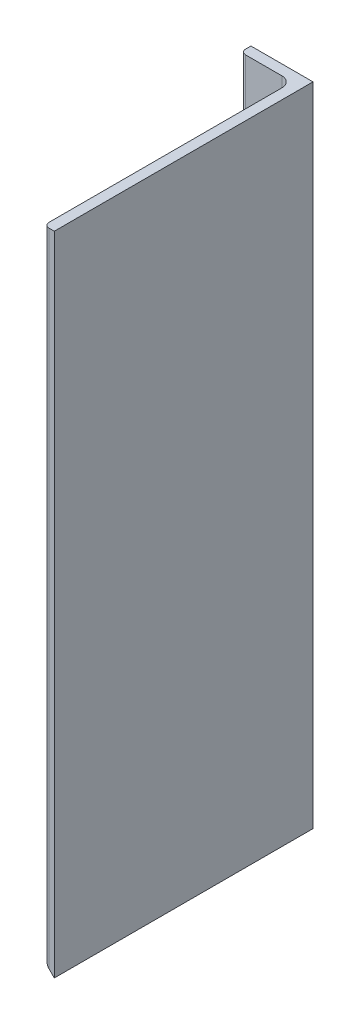
ISO-10303-21;
HEADER;
FILE_DESCRIPTION(('STEP AP214'),'2;1');
FILE_NAME('part.step','',(''),(''),'','','');
FILE_SCHEMA(('AUTOMOTIVE_DESIGN { 1 0 10303 214 1 1 1 1 }'));
ENDSEC;
DATA;
#1=APPLICATION_CONTEXT('core data for automotive mechanical design processes');
#2=APPLICATION_PROTOCOL_DEFINITION('international standard','automotive_design',2000,#1);
#3=PRODUCT_CONTEXT('',#1,'mechanical');
#4=PRODUCT('Part','Part','',(#3));
#5=PRODUCT_RELATED_PRODUCT_CATEGORY('part','',(#4));
#6=PRODUCT_DEFINITION_FORMATION('','',#4);
#7=PRODUCT_DEFINITION_CONTEXT('part definition',#1,'design');
#8=PRODUCT_DEFINITION('design','',#6,#7);
#9=PRODUCT_DEFINITION_SHAPE('','',#8);
#10=(LENGTH_UNIT() NAMED_UNIT(*) SI_UNIT(.MILLI.,.METRE.));
#11=(NAMED_UNIT(*) PLANE_ANGLE_UNIT() SI_UNIT($,.RADIAN.));
#12=(NAMED_UNIT(*) SI_UNIT($,.STERADIAN.) SOLID_ANGLE_UNIT());
#13=UNCERTAINTY_MEASURE_WITH_UNIT(LENGTH_MEASURE(1.E-05),#10,'distance_accuracy_value','');
#14=(GEOMETRIC_REPRESENTATION_CONTEXT(3) GLOBAL_UNCERTAINTY_ASSIGNED_CONTEXT((#13)) GLOBAL_UNIT_ASSIGNED_CONTEXT((#10,
#11,#12)) REPRESENTATION_CONTEXT('',''));
#15=CARTESIAN_POINT('',(0.,0.,0.));
#16=DIRECTION('',(0.,0.,1.));
#17=DIRECTION('',(1.,0.,0.));
#18=AXIS2_PLACEMENT_3D('',#15,#16,#17);
#19=CARTESIAN_POINT('',(172.628739257162,125.,52.4983163281009));
#20=DIRECTION('',(0.,0.,-1.));
#21=DIRECTION('',(-1.,0.,0.));
#22=AXIS2_PLACEMENT_3D('',#19,#20,#21);
#23=PLANE('',#22);
#24=DIRECTION('',(0.,-1.,0.));
#25=VECTOR('',#24,1.);
#26=CARTESIAN_POINT('',(173.628739257162,125.,52.4983163281009));
#27=LINE('',#26,#25);
#28=CARTESIAN_POINT('',(173.628739257162,125.,52.4983163281009));
#29=VERTEX_POINT('',#28);
#30=CARTESIAN_POINT('',(173.628739257162,1.,52.4983163281009));
#31=VERTEX_POINT('',#30);
#32=EDGE_CURVE('E123',#29,#31,#27,.T.);
#33=ORIENTED_EDGE('',*,*,#32,.T.);
#34=DIRECTION('',(-0.707106781186551,0.707106781186544,0.));
#35=VECTOR('',#34,1.);
#36=CARTESIAN_POINT('',(174.628739257162,0.,52.4983163281009));
#37=LINE('',#36,#35);
#38=CARTESIAN_POINT('',(174.628739257162,0.,52.4983163281009));
#39=VERTEX_POINT('',#38);
#40=EDGE_CURVE('E106',#39,#31,#37,.T.);
#41=ORIENTED_EDGE('',*,*,#40,.F.);
#42=DIRECTION('',(0.,-1.,0.));
#43=VECTOR('',#42,1.);
#44=CARTESIAN_POINT('',(174.628739257162,125.,52.4983163281009));
#45=LINE('',#44,#43);
#46=CARTESIAN_POINT('',(174.628739257162,125.,52.4983163281009));
#47=VERTEX_POINT('',#46);
#48=EDGE_CURVE('E121',#47,#39,#45,.T.);
#49=ORIENTED_EDGE('',*,*,#48,.F.);
#50=DIRECTION('',(1.,0.,0.));
#51=VECTOR('',#50,1.);
#52=CARTESIAN_POINT('',(172.628739257162,125.,52.4983163281009));
#53=LINE('',#52,#51);
#54=EDGE_CURVE('E114',#29,#47,#53,.T.);
#55=ORIENTED_EDGE('',*,*,#54,.F.);
#56=EDGE_LOOP('',(#33,#41,#49,#55));
#57=FACE_BOUND('',#56,.T.);
#58=ADVANCED_FACE('F33',(#57),#23,.F.);
#59=CARTESIAN_POINT('',(174.628739257162,125.,52.4983163281009));
#60=DIRECTION('',(-1.,0.,0.));
#61=DIRECTION('',(0.,0.,1.));
#62=AXIS2_PLACEMENT_3D('',#59,#60,#61);
#63=PLANE('',#62);
#64=DIRECTION('',(0.,0.,-1.));
#65=VECTOR('',#64,1.);
#66=CARTESIAN_POINT('',(174.628739257162,0.,52.4983163281009));
#67=LINE('',#66,#65);
#68=CARTESIAN_POINT('',(174.628739257162,0.,2.49831632810092));
#69=VERTEX_POINT('',#68);
#70=EDGE_CURVE('E103',#39,#69,#67,.T.);
#71=ORIENTED_EDGE('',*,*,#70,.T.);
#72=DIRECTION('',(0.,-1.,0.));
#73=VECTOR('',#72,1.);
#74=CARTESIAN_POINT('',(174.628739257162,125.,2.49831632810092));
#75=LINE('',#74,#73);
#76=CARTESIAN_POINT('',(174.628739257162,125.,2.49831632810092));
#77=VERTEX_POINT('',#76);
#78=EDGE_CURVE('E129',#77,#69,#75,.T.);
#79=ORIENTED_EDGE('',*,*,#78,.F.);
#80=DIRECTION('',(0.,0.,-1.));
#81=VECTOR('',#80,1.);
#82=CARTESIAN_POINT('',(174.628739257162,125.,52.4983163281009));
#83=LINE('',#82,#81);
#84=EDGE_CURVE('E127',#47,#77,#83,.T.);
#85=ORIENTED_EDGE('',*,*,#84,.F.);
#86=ORIENTED_EDGE('',*,*,#48,.T.);
#87=EDGE_LOOP('',(#71,#79,#85,#86));
#88=FACE_BOUND('',#87,.T.);
#89=ADVANCED_FACE('F126',(#88),#63,.F.);
#90=CARTESIAN_POINT('',(174.628739257162,125.,2.49831632810092));
#91=DIRECTION('',(0.,0.,1.));
#92=DIRECTION('',(1.,0.,0.));
#93=AXIS2_PLACEMENT_3D('',#90,#91,#92);
#94=PLANE('',#93);
#95=CARTESIAN_POINT('',(167.128739257162,20.,2.49831632810092));
#96=DIRECTION('',(0.,0.,1.));
#97=DIRECTION('',(1.,0.,0.));
#98=AXIS2_PLACEMENT_3D('',#95,#96,#97);
#99=CIRCLE('',#98,1.59999999999999);
#100=CARTESIAN_POINT('',(168.728739257162,20.,2.49831632810092));
#101=VERTEX_POINT('',#100);
#102=EDGE_CURVE('E115',#101,#101,#99,.T.);
#103=ORIENTED_EDGE('',*,*,#102,.T.);
#104=EDGE_LOOP('',(#103));
#105=FACE_BOUND('',#104,.T.);
#106=CARTESIAN_POINT('',(167.128739257162,105.,2.49831632810092));
#107=DIRECTION('',(0.,0.,1.));
#108=DIRECTION('',(1.,0.,0.));
#109=AXIS2_PLACEMENT_3D('',#106,#107,#108);
#110=CIRCLE('',#109,1.59999999999999);
#111=CARTESIAN_POINT('',(168.728739257162,105.,2.49831632810092));
#112=VERTEX_POINT('',#111);
#113=EDGE_CURVE('E183',#112,#112,#110,.T.);
#114=ORIENTED_EDGE('',*,*,#113,.T.);
#115=EDGE_LOOP('',(#114));
#116=FACE_BOUND('',#115,.T.);
#117=ORIENTED_EDGE('',*,*,#78,.T.);
#118=DIRECTION('',(-0.707106781186551,0.707106781186544,0.));
#119=VECTOR('',#118,1.);
#120=CARTESIAN_POINT('',(174.628739257162,0.,2.49831632810092));
#121=LINE('',#120,#119);
#122=CARTESIAN_POINT('',(162.628739257162,11.9999999999999,2.49831632810092));
#123=VERTEX_POINT('',#122);
#124=EDGE_CURVE('E109',#69,#123,#121,.T.);
#125=ORIENTED_EDGE('',*,*,#124,.T.);
#126=DIRECTION('',(0.,-1.,0.));
#127=VECTOR('',#126,1.);
#128=CARTESIAN_POINT('',(162.628739257162,125.,2.49831632810092));
#129=LINE('',#128,#127);
#130=CARTESIAN_POINT('',(162.628739257162,125.,2.49831632810092));
#131=VERTEX_POINT('',#130);
#132=EDGE_CURVE('E134',#131,#123,#129,.T.);
#133=ORIENTED_EDGE('',*,*,#132,.F.);
#134=DIRECTION('',(-1.,0.,0.));
#135=VECTOR('',#134,1.);
#136=CARTESIAN_POINT('',(174.628739257162,125.,2.49831632810092));
#137=LINE('',#136,#135);
#138=EDGE_CURVE('E190',#77,#131,#137,.T.);
#139=ORIENTED_EDGE('',*,*,#138,.F.);
#140=EDGE_LOOP('',(#117,#125,#133,#139));
#141=FACE_BOUND('',#140,.T.);
#142=ADVANCED_FACE('F203',(#105,#116,#141),#94,.F.);
#143=CARTESIAN_POINT('',(162.628739257162,125.,2.49831632810092));
#144=DIRECTION('',(1.,0.,0.));
#145=DIRECTION('',(0.,0.,-1.));
#146=AXIS2_PLACEMENT_3D('',#143,#144,#145);
#147=PLANE('',#146);
#148=ORIENTED_EDGE('',*,*,#132,.T.);
#149=DIRECTION('',(0.,0.,1.));
#150=VECTOR('',#149,1.);
#151=CARTESIAN_POINT('',(162.628739257162,11.9999999999999,2.49831632810092));
#152=LINE('',#151,#150);
#153=CARTESIAN_POINT('',(162.628739257162,11.9999999999999,3.49831632810092));
#154=VERTEX_POINT('',#153);
#155=EDGE_CURVE('E172',#123,#154,#152,.T.);
#156=ORIENTED_EDGE('',*,*,#155,.T.);
#157=DIRECTION('',(0.,-1.,0.));
#158=VECTOR('',#157,1.);
#159=CARTESIAN_POINT('',(162.628739257162,125.,3.49831632810092));
#160=LINE('',#159,#158);
#161=CARTESIAN_POINT('',(162.628739257162,125.,3.49831632810092));
#162=VERTEX_POINT('',#161);
#163=EDGE_CURVE('E132',#154,#162,#160,.F.);
#164=ORIENTED_EDGE('',*,*,#163,.T.);
#165=DIRECTION('',(0.,0.,1.));
#166=VECTOR('',#165,1.);
#167=CARTESIAN_POINT('',(162.628739257162,125.,2.49831632810092));
#168=LINE('',#167,#166);
#169=EDGE_CURVE('E192',#131,#162,#168,.T.);
#170=ORIENTED_EDGE('',*,*,#169,.F.);
#171=EDGE_LOOP('',(#148,#156,#164,#170));
#172=FACE_BOUND('',#171,.T.);
#173=ADVANCED_FACE('F199',(#172),#147,.F.);
#174=CARTESIAN_POINT('',(162.628739257162,125.,4.49831632810092));
#175=DIRECTION('',(0.,0.,-1.));
#176=DIRECTION('',(-1.,0.,0.));
#177=AXIS2_PLACEMENT_3D('',#174,#175,#176);
#178=PLANE('',#177);
#179=CARTESIAN_POINT('',(167.128739257162,20.,4.49831632810092));
#180=DIRECTION('',(0.,0.,1.));
#181=DIRECTION('',(1.,0.,0.));
#182=AXIS2_PLACEMENT_3D('',#179,#180,#181);
#183=CIRCLE('',#182,1.59999999999999);
#184=CARTESIAN_POINT('',(168.728739257162,20.,4.49831632810092));
#185=VERTEX_POINT('',#184);
#186=EDGE_CURVE('E180',#185,#185,#183,.T.);
#187=ORIENTED_EDGE('',*,*,#186,.F.);
#188=EDGE_LOOP('',(#187));
#189=FACE_BOUND('',#188,.T.);
#190=CARTESIAN_POINT('',(167.128739257162,105.,4.49831632810092));
#191=DIRECTION('',(0.,0.,1.));
#192=DIRECTION('',(1.,0.,0.));
#193=AXIS2_PLACEMENT_3D('',#190,#191,#192);
#194=CIRCLE('',#193,1.59999999999999);
#195=CARTESIAN_POINT('',(168.728739257162,105.,4.49831632810092));
#196=VERTEX_POINT('',#195);
#197=EDGE_CURVE('E177',#196,#196,#194,.T.);
#198=ORIENTED_EDGE('',*,*,#197,.F.);
#199=EDGE_LOOP('',(#198));
#200=FACE_BOUND('',#199,.T.);
#201=DIRECTION('',(0.,-1.,0.));
#202=VECTOR('',#201,1.);
#203=CARTESIAN_POINT('',(163.628739257162,125.,4.49831632810092));
#204=LINE('',#203,#202);
#205=CARTESIAN_POINT('',(163.628739257162,125.,4.49831632810092));
#206=VERTEX_POINT('',#205);
#207=CARTESIAN_POINT('',(163.628739257162,10.9999999999999,4.49831632810092));
#208=VERTEX_POINT('',#207);
#209=EDGE_CURVE('E128',#206,#208,#204,.T.);
#210=ORIENTED_EDGE('',*,*,#209,.T.);
#211=DIRECTION('',(0.707106781186551,-0.707106781186544,0.));
#212=VECTOR('',#211,1.);
#213=CARTESIAN_POINT('',(106.128739257162,68.4999999999993,4.49831632810092));
#214=LINE('',#213,#212);
#215=CARTESIAN_POINT('',(170.628739257162,3.99999999999996,4.49831632810092));
#216=VERTEX_POINT('',#215);
#217=EDGE_CURVE('E164',#208,#216,#214,.T.);
#218=ORIENTED_EDGE('',*,*,#217,.T.);
#219=DIRECTION('',(0.,-1.,0.));
#220=VECTOR('',#219,1.);
#221=CARTESIAN_POINT('',(170.628739257162,125.,4.49831632810092));
#222=LINE('',#221,#220);
#223=CARTESIAN_POINT('',(170.628739257162,125.,4.49831632810092));
#224=VERTEX_POINT('',#223);
#225=EDGE_CURVE('E55',#216,#224,#222,.F.);
#226=ORIENTED_EDGE('',*,*,#225,.T.);
#227=DIRECTION('',(1.,0.,0.));
#228=VECTOR('',#227,1.);
#229=CARTESIAN_POINT('',(162.628739257162,125.,4.49831632810092));
#230=LINE('',#229,#228);
#231=EDGE_CURVE('E157',#206,#224,#230,.T.);
#232=ORIENTED_EDGE('',*,*,#231,.F.);
#233=EDGE_LOOP('',(#210,#218,#226,#232));
#234=FACE_BOUND('',#233,.T.);
#235=ADVANCED_FACE('F166',(#189,#200,#234),#178,.F.);
#236=CARTESIAN_POINT('',(172.628739257162,125.,4.49831632810092));
#237=DIRECTION('',(1.,0.,0.));
#238=DIRECTION('',(0.,0.,-1.));
#239=AXIS2_PLACEMENT_3D('',#236,#237,#238);
#240=PLANE('',#239);
#241=DIRECTION('',(0.,-1.,0.));
#242=VECTOR('',#241,1.);
#243=CARTESIAN_POINT('',(172.628739257162,0.,6.49831632810092));
#244=LINE('',#243,#242);
#245=CARTESIAN_POINT('',(172.628739257162,125.,6.49831632810092));
#246=VERTEX_POINT('',#245);
#247=CARTESIAN_POINT('',(172.628739257162,1.99999999999998,6.49831632810092));
#248=VERTEX_POINT('',#247);
#249=EDGE_CURVE('E146',#246,#248,#244,.T.);
#250=ORIENTED_EDGE('',*,*,#249,.T.);
#251=DIRECTION('',(0.,0.,1.));
#252=VECTOR('',#251,1.);
#253=CARTESIAN_POINT('',(172.628739257162,1.99999999999999,4.49831632810092));
#254=LINE('',#253,#252);
#255=CARTESIAN_POINT('',(172.628739257162,1.99999999999999,51.4983163281009));
#256=VERTEX_POINT('',#255);
#257=EDGE_CURVE('E48',#248,#256,#254,.T.);
#258=ORIENTED_EDGE('',*,*,#257,.T.);
#259=DIRECTION('',(0.,-1.,0.));
#260=VECTOR('',#259,1.);
#261=CARTESIAN_POINT('',(172.628739257162,125.,51.4983163281009));
#262=LINE('',#261,#260);
#263=CARTESIAN_POINT('',(172.628739257162,125.,51.4983163281009));
#264=VERTEX_POINT('',#263);
#265=EDGE_CURVE('E144',#256,#264,#262,.F.);
#266=ORIENTED_EDGE('',*,*,#265,.T.);
#267=DIRECTION('',(0.,0.,1.));
#268=VECTOR('',#267,1.);
#269=CARTESIAN_POINT('',(172.628739257162,125.,4.49831632810092));
#270=LINE('',#269,#268);
#271=EDGE_CURVE('E155',#246,#264,#270,.T.);
#272=ORIENTED_EDGE('',*,*,#271,.F.);
#273=EDGE_LOOP('',(#250,#258,#266,#272));
#274=FACE_BOUND('',#273,.T.);
#275=ADVANCED_FACE('F161',(#274),#240,.F.);
#276=CARTESIAN_POINT('',(0.,125.,0.));
#277=DIRECTION('',(0.,1.,0.));
#278=DIRECTION('',(0.,0.,1.));
#279=AXIS2_PLACEMENT_3D('',#276,#277,#278);
#280=PLANE('',#279);
#281=ORIENTED_EDGE('',*,*,#169,.T.);
#282=CARTESIAN_POINT('',(163.628739257162,125.,3.49831632810092));
#283=DIRECTION('',(0.,1.,0.));
#284=DIRECTION('',(0.,0.,1.));
#285=AXIS2_PLACEMENT_3D('',#282,#283,#284);
#286=CIRCLE('',#285,1.);
#287=EDGE_CURVE('E141',#162,#206,#286,.T.);
#288=ORIENTED_EDGE('',*,*,#287,.T.);
#289=ORIENTED_EDGE('',*,*,#231,.T.);
#290=CARTESIAN_POINT('',(170.628739257162,125.,6.49831632810092));
#291=DIRECTION('',(0.,1.,0.));
#292=DIRECTION('',(0.,0.,1.));
#293=AXIS2_PLACEMENT_3D('',#290,#291,#292);
#294=CIRCLE('',#293,2.);
#295=EDGE_CURVE('E41',#224,#246,#294,.F.);
#296=ORIENTED_EDGE('',*,*,#295,.T.);
#297=ORIENTED_EDGE('',*,*,#271,.T.);
#298=CARTESIAN_POINT('',(173.628739257162,125.,51.4983163281009));
#299=DIRECTION('',(0.,1.,0.));
#300=DIRECTION('',(0.,0.,1.));
#301=AXIS2_PLACEMENT_3D('',#298,#299,#300);
#302=CIRCLE('',#301,1.);
#303=EDGE_CURVE('E139',#264,#29,#302,.T.);
#304=ORIENTED_EDGE('',*,*,#303,.T.);
#305=ORIENTED_EDGE('',*,*,#54,.T.);
#306=ORIENTED_EDGE('',*,*,#84,.T.);
#307=ORIENTED_EDGE('',*,*,#138,.T.);
#308=EDGE_LOOP('',(#281,#288,#289,#296,#297,#304,#305,#306,#307));
#309=FACE_BOUND('',#308,.T.);
#310=ADVANCED_FACE('F154',(#309),#280,.T.);
#311=CARTESIAN_POINT('',(163.628739257162,125.,3.49831632810092));
#312=DIRECTION('',(0.,-1.,0.));
#313=DIRECTION('',(0.,0.,-1.));
#314=AXIS2_PLACEMENT_3D('',#311,#312,#313);
#315=CYLINDRICAL_SURFACE('',#314,1.);
#316=CARTESIAN_POINT('',(163.628739257162,10.9999999999999,3.49831632810092));
#317=DIRECTION('',(0.707106781186544,0.707106781186551,0.));
#318=DIRECTION('',(0.707106781186551,-0.707106781186544,0.));
#319=AXIS2_PLACEMENT_3D('',#316,#317,#318);
#320=ELLIPSE('',#319,1.41421356237309,1.);
#321=EDGE_CURVE('E170',#208,#154,#320,.F.);
#322=ORIENTED_EDGE('',*,*,#321,.F.);
#323=ORIENTED_EDGE('',*,*,#209,.F.);
#324=ORIENTED_EDGE('',*,*,#287,.F.);
#325=ORIENTED_EDGE('',*,*,#163,.F.);
#326=EDGE_LOOP('',(#322,#323,#324,#325));
#327=FACE_BOUND('',#326,.T.);
#328=ADVANCED_FACE('F209',(#327),#315,.T.);
#329=CARTESIAN_POINT('',(173.628739257162,125.,51.4983163281009));
#330=DIRECTION('',(0.,-1.,0.));
#331=DIRECTION('',(0.,0.,-1.));
#332=AXIS2_PLACEMENT_3D('',#329,#330,#331);
#333=CYLINDRICAL_SURFACE('',#332,1.);
#334=CARTESIAN_POINT('',(173.628739257162,0.999999999999987,51.4983163281009));
#335=DIRECTION('',(0.707106781186544,0.707106781186551,0.));
#336=DIRECTION('',(0.707106781186551,-0.707106781186544,0.));
#337=AXIS2_PLACEMENT_3D('',#334,#335,#336);
#338=ELLIPSE('',#337,1.41421356237309,1.);
#339=EDGE_CURVE('E168',#31,#256,#338,.F.);
#340=ORIENTED_EDGE('',*,*,#339,.F.);
#341=ORIENTED_EDGE('',*,*,#32,.F.);
#342=ORIENTED_EDGE('',*,*,#303,.F.);
#343=ORIENTED_EDGE('',*,*,#265,.F.);
#344=EDGE_LOOP('',(#340,#341,#342,#343));
#345=FACE_BOUND('',#344,.T.);
#346=ADVANCED_FACE('F207',(#345),#333,.T.);
#347=CARTESIAN_POINT('',(170.628739257162,125.,6.49831632810092));
#348=DIRECTION('',(0.,1.,0.));
#349=DIRECTION('',(0.,0.,1.));
#350=AXIS2_PLACEMENT_3D('',#347,#348,#349);
#351=CYLINDRICAL_SURFACE('',#350,2.);
#352=ORIENTED_EDGE('',*,*,#225,.F.);
#353=CARTESIAN_POINT('',(170.628739257162,3.99999999999996,6.49831632810092));
#354=DIRECTION('',(0.707106781186544,0.707106781186551,0.));
#355=DIRECTION('',(-0.707106781186551,0.707106781186544,0.));
#356=AXIS2_PLACEMENT_3D('',#353,#354,#355);
#357=ELLIPSE('',#356,2.82842712474617,2.);
#358=EDGE_CURVE('E11',#216,#248,#357,.F.);
#359=ORIENTED_EDGE('',*,*,#358,.T.);
#360=ORIENTED_EDGE('',*,*,#249,.F.);
#361=ORIENTED_EDGE('',*,*,#295,.F.);
#362=EDGE_LOOP('',(#352,#359,#360,#361));
#363=FACE_BOUND('',#362,.T.);
#364=ADVANCED_FACE('F35',(#363),#351,.F.);
#365=CARTESIAN_POINT('',(167.128739257162,105.,2.49831632810092));
#366=DIRECTION('',(0.,0.,1.));
#367=DIRECTION('',(1.,0.,0.));
#368=AXIS2_PLACEMENT_3D('',#365,#366,#367);
#369=CYLINDRICAL_SURFACE('',#368,1.59999999999999);
#370=ORIENTED_EDGE('',*,*,#113,.F.);
#371=EDGE_LOOP('',(#370));
#372=FACE_BOUND('',#371,.T.);
#373=ORIENTED_EDGE('',*,*,#197,.T.);
#374=EDGE_LOOP('',(#373));
#375=FACE_BOUND('',#374,.T.);
#376=ADVANCED_FACE('F214',(#372,#375),#369,.F.);
#377=CARTESIAN_POINT('',(167.128739257162,20.,2.49831632810092));
#378=DIRECTION('',(0.,0.,1.));
#379=DIRECTION('',(1.,0.,0.));
#380=AXIS2_PLACEMENT_3D('',#377,#378,#379);
#381=CYLINDRICAL_SURFACE('',#380,1.59999999999999);
#382=ORIENTED_EDGE('',*,*,#102,.F.);
#383=EDGE_LOOP('',(#382));
#384=FACE_BOUND('',#383,.T.);
#385=ORIENTED_EDGE('',*,*,#186,.T.);
#386=EDGE_LOOP('',(#385));
#387=FACE_BOUND('',#386,.T.);
#388=ADVANCED_FACE('F238',(#384,#387),#381,.F.);
#389=CARTESIAN_POINT('',(174.628739257162,0.,2.49831632810092));
#390=DIRECTION('',(0.707106781186544,0.707106781186551,0.));
#391=DIRECTION('',(-0.707106781186551,0.707106781186544,0.));
#392=AXIS2_PLACEMENT_3D('',#389,#390,#391);
#393=PLANE('',#392);
#394=ORIENTED_EDGE('',*,*,#321,.T.);
#395=ORIENTED_EDGE('',*,*,#155,.F.);
#396=ORIENTED_EDGE('',*,*,#124,.F.);
#397=ORIENTED_EDGE('',*,*,#70,.F.);
#398=ORIENTED_EDGE('',*,*,#40,.T.);
#399=ORIENTED_EDGE('',*,*,#339,.T.);
#400=ORIENTED_EDGE('',*,*,#257,.F.);
#401=ORIENTED_EDGE('',*,*,#358,.F.);
#402=ORIENTED_EDGE('',*,*,#217,.F.);
#403=EDGE_LOOP('',(#394,#395,#396,#397,#398,#399,#400,#401,#402));
#404=FACE_BOUND('',#403,.T.);
#405=ADVANCED_FACE('F105',(#404),#393,.F.);
#406=CLOSED_SHELL('',(#58,#89,#142,#173,#235,#275,#310,#328,#346,#364,#376,#388,#405));
#407=MANIFOLD_SOLID_BREP('B2',#406);
#408=ADVANCED_BREP_SHAPE_REPRESENTATION('',(#18,#407),#14);
#409=SHAPE_DEFINITION_REPRESENTATION(#9,#408);
ENDSEC;
END-ISO-10303-21;
